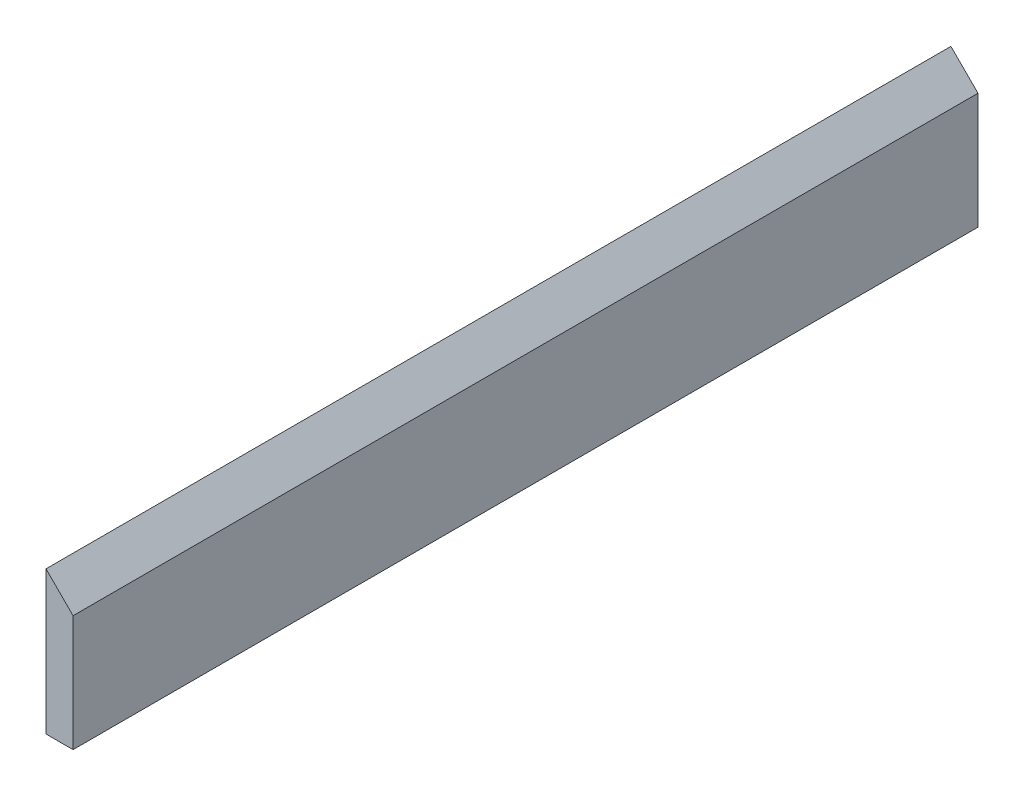
ISO-10303-21;
HEADER;
FILE_DESCRIPTION(('STEP AP214'),'2;1');
FILE_NAME('part.step','',(''),(''),'','','');
FILE_SCHEMA(('AUTOMOTIVE_DESIGN { 1 0 10303 214 1 1 1 1 }'));
ENDSEC;
DATA;
#1=APPLICATION_CONTEXT('core data for automotive mechanical design processes');
#2=APPLICATION_PROTOCOL_DEFINITION('international standard','automotive_design',2000,#1);
#3=PRODUCT_CONTEXT('',#1,'mechanical');
#4=PRODUCT('Part','Part','',(#3));
#5=PRODUCT_RELATED_PRODUCT_CATEGORY('part','',(#4));
#6=PRODUCT_DEFINITION_FORMATION('','',#4);
#7=PRODUCT_DEFINITION_CONTEXT('part definition',#1,'design');
#8=PRODUCT_DEFINITION('design','',#6,#7);
#9=PRODUCT_DEFINITION_SHAPE('','',#8);
#10=(LENGTH_UNIT() NAMED_UNIT(*) SI_UNIT(.MILLI.,.METRE.));
#11=(NAMED_UNIT(*) PLANE_ANGLE_UNIT() SI_UNIT($,.RADIAN.));
#12=(NAMED_UNIT(*) SI_UNIT($,.STERADIAN.) SOLID_ANGLE_UNIT());
#13=UNCERTAINTY_MEASURE_WITH_UNIT(LENGTH_MEASURE(1.E-05),#10,'distance_accuracy_value','');
#14=(GEOMETRIC_REPRESENTATION_CONTEXT(3) GLOBAL_UNCERTAINTY_ASSIGNED_CONTEXT((#13)) GLOBAL_UNIT_ASSIGNED_CONTEXT((#10,
#11,#12)) REPRESENTATION_CONTEXT('',''));
#15=CARTESIAN_POINT('',(0.,0.,0.));
#16=DIRECTION('',(0.,0.,1.));
#17=DIRECTION('',(1.,0.,0.));
#18=AXIS2_PLACEMENT_3D('',#15,#16,#17);
#19=CARTESIAN_POINT('',(209.5,46.5,-0.999999999999999));
#20=DIRECTION('',(0.,0.,1.));
#21=DIRECTION('',(1.,0.,0.));
#22=AXIS2_PLACEMENT_3D('',#19,#20,#21);
#23=PLANE('',#22);
#24=DIRECTION('',(0.,1.,0.));
#25=VECTOR('',#24,1.);
#26=CARTESIAN_POINT('',(219.5,-4.,-1.));
#27=LINE('',#26,#25);
#28=CARTESIAN_POINT('',(219.5,28.,-1.));
#29=VERTEX_POINT('',#28);
#30=CARTESIAN_POINT('',(219.5,43.,-1.));
#31=VERTEX_POINT('',#30);
#32=EDGE_CURVE('E112',#29,#31,#27,.T.);
#33=ORIENTED_EDGE('',*,*,#32,.F.);
#34=DIRECTION('',(1.,0.,0.));
#35=VECTOR('',#34,1.);
#36=CARTESIAN_POINT('',(209.5,28.,-0.999999999999999));
#37=LINE('',#36,#35);
#38=CARTESIAN_POINT('',(216.,28.,-1.));
#39=VERTEX_POINT('',#38);
#40=EDGE_CURVE('E65',#39,#29,#37,.T.);
#41=ORIENTED_EDGE('',*,*,#40,.F.);
#42=DIRECTION('',(0.,-1.,0.));
#43=VECTOR('',#42,1.);
#44=CARTESIAN_POINT('',(216.,70.,-1.));
#45=LINE('',#44,#43);
#46=CARTESIAN_POINT('',(216.,46.5,-1.));
#47=VERTEX_POINT('',#46);
#48=EDGE_CURVE('E11',#47,#39,#45,.T.);
#49=ORIENTED_EDGE('',*,*,#48,.F.);
#50=DIRECTION('',(-0.707106781186551,0.707106781186544,0.));
#51=VECTOR('',#50,1.);
#52=CARTESIAN_POINT('',(219.5,43.,-1.));
#53=LINE('',#52,#51);
#54=EDGE_CURVE('E105',#31,#47,#53,.T.);
#55=ORIENTED_EDGE('',*,*,#54,.F.);
#56=EDGE_LOOP('',(#33,#41,#49,#55));
#57=FACE_BOUND('',#56,.T.);
#58=ADVANCED_FACE('F43',(#57),#23,.F.);
#59=CARTESIAN_POINT('',(209.5,46.5,116.));
#60=DIRECTION('',(0.,0.,1.));
#61=DIRECTION('',(1.,0.,0.));
#62=AXIS2_PLACEMENT_3D('',#59,#60,#61);
#63=PLANE('',#62);
#64=DIRECTION('',(1.,0.,0.));
#65=VECTOR('',#64,1.);
#66=CARTESIAN_POINT('',(209.5,28.,116.));
#67=LINE('',#66,#65);
#68=CARTESIAN_POINT('',(216.,28.,116.));
#69=VERTEX_POINT('',#68);
#70=CARTESIAN_POINT('',(219.5,28.,116.));
#71=VERTEX_POINT('',#70);
#72=EDGE_CURVE('E89',#69,#71,#67,.T.);
#73=ORIENTED_EDGE('',*,*,#72,.T.);
#74=DIRECTION('',(0.,1.,0.));
#75=VECTOR('',#74,1.);
#76=CARTESIAN_POINT('',(219.5,-4.,116.));
#77=LINE('',#76,#75);
#78=CARTESIAN_POINT('',(219.5,43.,116.));
#79=VERTEX_POINT('',#78);
#80=EDGE_CURVE('E97',#71,#79,#77,.T.);
#81=ORIENTED_EDGE('',*,*,#80,.T.);
#82=DIRECTION('',(-0.707106781186551,0.707106781186544,0.));
#83=VECTOR('',#82,1.);
#84=CARTESIAN_POINT('',(219.5,43.,116.));
#85=LINE('',#84,#83);
#86=CARTESIAN_POINT('',(216.,46.5,116.));
#87=VERTEX_POINT('',#86);
#88=EDGE_CURVE('E102',#79,#87,#85,.T.);
#89=ORIENTED_EDGE('',*,*,#88,.T.);
#90=DIRECTION('',(0.,-1.,0.));
#91=VECTOR('',#90,1.);
#92=CARTESIAN_POINT('',(216.,70.,116.));
#93=LINE('',#92,#91);
#94=EDGE_CURVE('E86',#87,#69,#93,.T.);
#95=ORIENTED_EDGE('',*,*,#94,.T.);
#96=EDGE_LOOP('',(#73,#81,#89,#95));
#97=FACE_BOUND('',#96,.T.);
#98=ADVANCED_FACE('F100',(#97),#63,.T.);
#99=CARTESIAN_POINT('',(219.5,43.,119.5));
#100=DIRECTION('',(-0.707106781186544,-0.707106781186551,0.));
#101=DIRECTION('',(0.707106781186551,-0.707106781186544,0.));
#102=AXIS2_PLACEMENT_3D('',#99,#100,#101);
#103=PLANE('',#102);
#104=DIRECTION('',(0.,0.,-1.));
#105=VECTOR('',#104,1.);
#106=CARTESIAN_POINT('',(219.5,43.,119.5));
#107=LINE('',#106,#105);
#108=EDGE_CURVE('E47',#79,#31,#107,.T.);
#109=ORIENTED_EDGE('',*,*,#108,.T.);
#110=ORIENTED_EDGE('',*,*,#54,.T.);
#111=DIRECTION('',(0.,0.,-1.));
#112=VECTOR('',#111,1.);
#113=CARTESIAN_POINT('',(216.,46.5,0.));
#114=LINE('',#113,#112);
#115=EDGE_CURVE('E110',#87,#47,#114,.T.);
#116=ORIENTED_EDGE('',*,*,#115,.F.);
#117=ORIENTED_EDGE('',*,*,#88,.F.);
#118=EDGE_LOOP('',(#109,#110,#116,#117));
#119=FACE_BOUND('',#118,.T.);
#120=ADVANCED_FACE('F117',(#119),#103,.F.);
#121=CARTESIAN_POINT('',(216.,70.,0.));
#122=DIRECTION('',(1.,0.,0.));
#123=DIRECTION('',(0.,0.,-1.));
#124=AXIS2_PLACEMENT_3D('',#121,#122,#123);
#125=PLANE('',#124);
#126=ORIENTED_EDGE('',*,*,#94,.F.);
#127=ORIENTED_EDGE('',*,*,#115,.T.);
#128=ORIENTED_EDGE('',*,*,#48,.T.);
#129=DIRECTION('',(0.,0.,1.));
#130=VECTOR('',#129,1.);
#131=CARTESIAN_POINT('',(216.,28.,0.));
#132=LINE('',#131,#130);
#133=EDGE_CURVE('E52',#39,#69,#132,.T.);
#134=ORIENTED_EDGE('',*,*,#133,.T.);
#135=EDGE_LOOP('',(#126,#127,#128,#134));
#136=FACE_BOUND('',#135,.T.);
#137=ADVANCED_FACE('F84',(#136),#125,.F.);
#138=CARTESIAN_POINT('',(219.5,-4.,-4.5));
#139=DIRECTION('',(-1.,0.,0.));
#140=DIRECTION('',(0.,0.,1.));
#141=AXIS2_PLACEMENT_3D('',#138,#139,#140);
#142=PLANE('',#141);
#143=DIRECTION('',(0.,0.,1.));
#144=VECTOR('',#143,1.);
#145=CARTESIAN_POINT('',(219.5,28.,116.));
#146=LINE('',#145,#144);
#147=EDGE_CURVE('E92',#29,#71,#146,.T.);
#148=ORIENTED_EDGE('',*,*,#147,.F.);
#149=ORIENTED_EDGE('',*,*,#32,.T.);
#150=ORIENTED_EDGE('',*,*,#108,.F.);
#151=ORIENTED_EDGE('',*,*,#80,.F.);
#152=EDGE_LOOP('',(#148,#149,#150,#151));
#153=FACE_BOUND('',#152,.T.);
#154=ADVANCED_FACE('F45',(#153),#142,.F.);
#155=CARTESIAN_POINT('',(209.5,28.,116.));
#156=DIRECTION('',(0.,1.,0.));
#157=DIRECTION('',(0.,0.,1.));
#158=AXIS2_PLACEMENT_3D('',#155,#156,#157);
#159=PLANE('',#158);
#160=ORIENTED_EDGE('',*,*,#40,.T.);
#161=ORIENTED_EDGE('',*,*,#147,.T.);
#162=ORIENTED_EDGE('',*,*,#72,.F.);
#163=ORIENTED_EDGE('',*,*,#133,.F.);
#164=EDGE_LOOP('',(#160,#161,#162,#163));
#165=FACE_BOUND('',#164,.T.);
#166=ADVANCED_FACE('F90',(#165),#159,.F.);
#167=CLOSED_SHELL('',(#58,#98,#120,#137,#154,#166));
#168=MANIFOLD_SOLID_BREP('B2',#167);
#169=ADVANCED_BREP_SHAPE_REPRESENTATION('',(#18,#168),#14);
#170=SHAPE_DEFINITION_REPRESENTATION(#9,#169);
ENDSEC;
END-ISO-10303-21;
